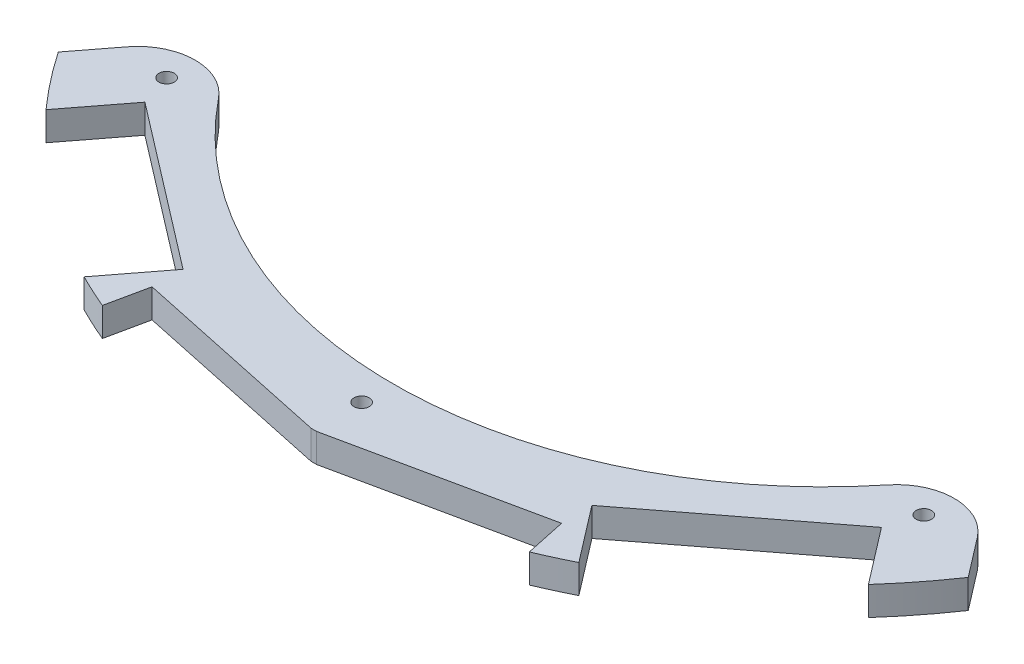
ISO-10303-21;
HEADER;
FILE_DESCRIPTION(('STEP AP214'),'2;1');
FILE_NAME('part.step','',(''),(''),'','','');
FILE_SCHEMA(('AUTOMOTIVE_DESIGN { 1 0 10303 214 1 1 1 1 }'));
ENDSEC;
DATA;
#1=APPLICATION_CONTEXT('core data for automotive mechanical design processes');
#2=APPLICATION_PROTOCOL_DEFINITION('international standard','automotive_design',2000,#1);
#3=PRODUCT_CONTEXT('',#1,'mechanical');
#4=PRODUCT('Part','Part','',(#3));
#5=PRODUCT_RELATED_PRODUCT_CATEGORY('part','',(#4));
#6=PRODUCT_DEFINITION_FORMATION('','',#4);
#7=PRODUCT_DEFINITION_CONTEXT('part definition',#1,'design');
#8=PRODUCT_DEFINITION('design','',#6,#7);
#9=PRODUCT_DEFINITION_SHAPE('','',#8);
#10=(LENGTH_UNIT() NAMED_UNIT(*) SI_UNIT(.MILLI.,.METRE.));
#11=(NAMED_UNIT(*) PLANE_ANGLE_UNIT() SI_UNIT($,.RADIAN.));
#12=(NAMED_UNIT(*) SI_UNIT($,.STERADIAN.) SOLID_ANGLE_UNIT());
#13=UNCERTAINTY_MEASURE_WITH_UNIT(LENGTH_MEASURE(1.E-05),#10,'distance_accuracy_value','');
#14=(GEOMETRIC_REPRESENTATION_CONTEXT(3) GLOBAL_UNCERTAINTY_ASSIGNED_CONTEXT((#13)) GLOBAL_UNIT_ASSIGNED_CONTEXT((#10,
#11,#12)) REPRESENTATION_CONTEXT('',''));
#15=CARTESIAN_POINT('',(0.,0.,0.));
#16=DIRECTION('',(0.,0.,1.));
#17=DIRECTION('',(1.,0.,0.));
#18=AXIS2_PLACEMENT_3D('',#15,#16,#17);
#19=CARTESIAN_POINT('',(84.021948487146,6.35,-34.47476750129));
#20=DIRECTION('',(0.,1.,0.));
#21=DIRECTION('',(0.,0.,1.));
#22=AXIS2_PLACEMENT_3D('',#19,#20,#21);
#23=PLANE('',#22);
#24=CARTESIAN_POINT('',(-83.8199999999999,6.35,-40.6400000000001));
#25=DIRECTION('',(0.,1.,0.));
#26=DIRECTION('',(0.,0.,-1.));
#27=AXIS2_PLACEMENT_3D('',#24,#25,#26);
#28=CIRCLE('',#27,1.70053000000001);
#29=CARTESIAN_POINT('',(-83.8199999999999,6.35,-42.3405300000001));
#30=VERTEX_POINT('',#29);
#31=EDGE_CURVE('E392',#30,#30,#28,.T.);
#32=ORIENTED_EDGE('',*,*,#31,.F.);
#33=EDGE_LOOP('',(#32));
#34=FACE_BOUND('',#33,.T.);
#35=CARTESIAN_POINT('',(84.021948487146,6.35,-34.47476750129));
#36=DIRECTION('',(0.,1.,0.));
#37=DIRECTION('',(0.,0.,1.));
#38=AXIS2_PLACEMENT_3D('',#35,#36,#37);
#39=CIRCLE('',#38,12.7);
#40=CARTESIAN_POINT('',(94.0975359088447,6.35,-42.2060376497007));
#41=VERTEX_POINT('',#40);
#42=CARTESIAN_POINT('',(74.1370133710112,6.35,-42.4483525011382));
#43=VERTEX_POINT('',#42);
#44=EDGE_CURVE('E243',#41,#43,#39,.T.);
#45=ORIENTED_EDGE('',*,*,#44,.T.);
#46=CARTESIAN_POINT('',(0.,6.35,-102.25024));
#47=DIRECTION('',(0.,-1.,0.));
#48=DIRECTION('',(0.,0.,-1.));
#49=AXIS2_PLACEMENT_3D('',#46,#47,#48);
#50=CIRCLE('',#49,95.25);
#51=CARTESIAN_POINT('',(-74.1370133710112,6.35,-42.4483525011383));
#52=VERTEX_POINT('',#51);
#53=EDGE_CURVE('E129',#43,#52,#50,.T.);
#54=ORIENTED_EDGE('',*,*,#53,.T.);
#55=CARTESIAN_POINT('',(-84.021948487146,6.35,-34.4747675012901));
#56=DIRECTION('',(0.,1.,0.));
#57=DIRECTION('',(0.,0.,-1.));
#58=AXIS2_PLACEMENT_3D('',#55,#56,#57);
#59=CIRCLE('',#58,12.7);
#60=CARTESIAN_POINT('',(-94.0975359088447,6.35,-42.2060376497008));
#61=VERTEX_POINT('',#60);
#62=EDGE_CURVE('E294',#52,#61,#59,.T.);
#63=ORIENTED_EDGE('',*,*,#62,.T.);
#64=DIRECTION('',(-0.608761429008708,0.,0.793353340291245));
#65=VECTOR('',#64,1.);
#66=CARTESIAN_POINT('',(-100.72984212007,6.35,-33.5626479147791));
#67=LINE('',#66,#65);
#68=CARTESIAN_POINT('',(-100.72984212007,6.35,-33.562647914779));
#69=VERTEX_POINT('',#68);
#70=EDGE_CURVE('E313',#61,#69,#67,.T.);
#71=ORIENTED_EDGE('',*,*,#70,.T.);
#72=CARTESIAN_POINT('',(0.,6.35,-102.25024));
#73=DIRECTION('',(0.,1.,0.));
#74=DIRECTION('',(0.,0.,-1.));
#75=AXIS2_PLACEMENT_3D('',#72,#73,#74);
#76=CIRCLE('',#75,121.92);
#77=CARTESIAN_POINT('',(-91.0399261764068,6.35,-21.1563546460821));
#78=VERTEX_POINT('',#77);
#79=EDGE_CURVE('E310',#69,#78,#76,.T.);
#80=ORIENTED_EDGE('',*,*,#79,.T.);
#81=DIRECTION('',(0.608761429008712,0.,-0.793353340291242));
#82=VECTOR('',#81,1.);
#83=CARTESIAN_POINT('',(-91.0399261764068,6.35,-21.1563546460821));
#84=LINE('',#83,#82);
#85=CARTESIAN_POINT('',(-81.5324725760255,6.35,-33.5467094092098));
#86=VERTEX_POINT('',#85);
#87=EDGE_CURVE('E312',#78,#86,#84,.T.);
#88=ORIENTED_EDGE('',*,*,#87,.T.);
#89=DIRECTION('',(0.793353340291238,0.,0.608761429008717));
#90=VECTOR('',#89,1.);
#91=CARTESIAN_POINT('',(-81.5324725760255,6.35,-33.5467094092098));
#92=LINE('',#91,#90);
#93=CARTESIAN_POINT('',(-45.26035785791,6.35,-5.71413687493115));
#94=VERTEX_POINT('',#93);
#95=EDGE_CURVE('E315',#86,#94,#92,.T.);
#96=ORIENTED_EDGE('',*,*,#95,.T.);
#97=DIRECTION('',(-0.608761429008719,0.,0.793353340291237));
#98=VECTOR('',#97,1.);
#99=CARTESIAN_POINT('',(-54.7678114582914,6.35,6.67621788819646));
#100=LINE('',#99,#98);
#101=CARTESIAN_POINT('',(-54.7678114582914,6.35,6.67621788819642));
#102=VERTEX_POINT('',#101);
#103=EDGE_CURVE('E321',#94,#102,#100,.T.);
#104=ORIENTED_EDGE('',*,*,#103,.T.);
#105=CARTESIAN_POINT('',(0.,6.35,-102.25024));
#106=DIRECTION('',(0.,1.,0.));
#107=DIRECTION('',(0.,0.,1.));
#108=AXIS2_PLACEMENT_3D('',#105,#106,#107);
#109=CIRCLE('',#108,121.92);
#110=CARTESIAN_POINT('',(-47.2594801269617,6.35,10.1376060427518));
#111=VERTEX_POINT('',#110);
#112=EDGE_CURVE('E323',#102,#111,#109,.T.);
#113=ORIENTED_EDGE('',*,*,#112,.T.);
#114=DIRECTION('',(0.207911690817761,0.,-0.978147600733805));
#115=VECTOR('',#114,1.);
#116=CARTESIAN_POINT('',(-47.2594801269617,6.35,10.1376060427518));
#117=LINE('',#116,#115);
#118=CARTESIAN_POINT('',(-45.332616871229,6.35,1.07242715298415));
#119=VERTEX_POINT('',#118);
#120=EDGE_CURVE('E325',#111,#119,#117,.T.);
#121=ORIENTED_EDGE('',*,*,#120,.T.);
#122=DIRECTION('',(0.978147600733805,0.,0.207911690817761));
#123=VECTOR('',#122,1.);
#124=CARTESIAN_POINT('',(-45.332616871229,6.35,1.07242715298415));
#125=LINE('',#124,#123);
#126=CARTESIAN_POINT('',(-0.611708565679415,6.35,10.5781496571722));
#127=VERTEX_POINT('',#126);
#128=EDGE_CURVE('E327',#119,#127,#125,.T.);
#129=ORIENTED_EDGE('',*,*,#128,.T.);
#130=DIRECTION('',(1.,0.,0.));
#131=VECTOR('',#130,1.);
#132=CARTESIAN_POINT('',(-0.611708565679415,6.35,10.5781496571722));
#133=LINE('',#132,#131);
#134=CARTESIAN_POINT('',(0.611708565679403,6.35,10.5781496571722));
#135=VERTEX_POINT('',#134);
#136=EDGE_CURVE('E329',#127,#135,#133,.T.);
#137=ORIENTED_EDGE('',*,*,#136,.T.);
#138=DIRECTION('',(0.978147600733805,0.,-0.20791169081776));
#139=VECTOR('',#138,1.);
#140=CARTESIAN_POINT('',(45.332616871229,6.35,1.0724271529842));
#141=LINE('',#140,#139);
#142=CARTESIAN_POINT('',(45.332616871229,6.35,1.0724271529842));
#143=VERTEX_POINT('',#142);
#144=EDGE_CURVE('E331',#135,#143,#141,.T.);
#145=ORIENTED_EDGE('',*,*,#144,.T.);
#146=DIRECTION('',(0.207911690817759,0.,0.978147600733806));
#147=VECTOR('',#146,1.);
#148=CARTESIAN_POINT('',(47.2594801269617,6.35,10.1376060427519));
#149=LINE('',#148,#147);
#150=CARTESIAN_POINT('',(47.2594801269617,6.35,10.1376060427519));
#151=VERTEX_POINT('',#150);
#152=EDGE_CURVE('E333',#143,#151,#149,.T.);
#153=ORIENTED_EDGE('',*,*,#152,.T.);
#154=CARTESIAN_POINT('',(0.,6.35,-102.25024));
#155=DIRECTION('',(0.,1.,0.));
#156=DIRECTION('',(0.,0.,-1.));
#157=AXIS2_PLACEMENT_3D('',#154,#155,#156);
#158=CIRCLE('',#157,121.92);
#159=CARTESIAN_POINT('',(54.7678114582914,6.35,6.67621788819651));
#160=VERTEX_POINT('',#159);
#161=EDGE_CURVE('E335',#151,#160,#158,.T.);
#162=ORIENTED_EDGE('',*,*,#161,.T.);
#163=DIRECTION('',(-0.608761429008718,0.,-0.793353340291237));
#164=VECTOR('',#163,1.);
#165=CARTESIAN_POINT('',(54.7678114582914,6.35,6.67621788819651));
#166=LINE('',#165,#164);
#167=CARTESIAN_POINT('',(45.26035785791,6.35,-5.71413687493111));
#168=VERTEX_POINT('',#167);
#169=EDGE_CURVE('E337',#160,#168,#166,.T.);
#170=ORIENTED_EDGE('',*,*,#169,.T.);
#171=DIRECTION('',(0.793353340291238,0.,-0.608761429008716));
#172=VECTOR('',#171,1.);
#173=CARTESIAN_POINT('',(45.26035785791,6.35,-5.71413687493111));
#174=LINE('',#173,#172);
#175=CARTESIAN_POINT('',(81.5324725760255,6.35,-33.5467094092097));
#176=VERTEX_POINT('',#175);
#177=EDGE_CURVE('E184',#168,#176,#174,.T.);
#178=ORIENTED_EDGE('',*,*,#177,.T.);
#179=DIRECTION('',(0.608761429008711,0.,0.793353340291242));
#180=VECTOR('',#179,1.);
#181=CARTESIAN_POINT('',(91.0399261764068,6.35,-21.156354646082));
#182=LINE('',#181,#180);
#183=CARTESIAN_POINT('',(91.0399261764068,6.35,-21.156354646082));
#184=VERTEX_POINT('',#183);
#185=EDGE_CURVE('E178',#176,#184,#182,.T.);
#186=ORIENTED_EDGE('',*,*,#185,.T.);
#187=CARTESIAN_POINT('',(0.,6.35,-102.25024));
#188=DIRECTION('',(0.,1.,0.));
#189=DIRECTION('',(0.,0.,1.));
#190=AXIS2_PLACEMENT_3D('',#187,#188,#189);
#191=CIRCLE('',#190,121.92);
#192=CARTESIAN_POINT('',(100.72984212007,6.35,-33.5626479147789));
#193=VERTEX_POINT('',#192);
#194=EDGE_CURVE('E182',#184,#193,#191,.T.);
#195=ORIENTED_EDGE('',*,*,#194,.T.);
#196=DIRECTION('',(-0.608761429008712,0.,-0.793353340291242));
#197=VECTOR('',#196,1.);
#198=CARTESIAN_POINT('',(100.72984212007,6.35,-33.5626479147789));
#199=LINE('',#198,#197);
#200=EDGE_CURVE('E50',#193,#41,#199,.T.);
#201=ORIENTED_EDGE('',*,*,#200,.T.);
#202=EDGE_LOOP('',(#45,#54,#63,#71,#80,#88,#96,#104,#113,#121,#129,#137,#145,#153,#162,#170,
#178,#186,#195,#201));
#203=FACE_BOUND('',#202,.T.);
#204=CARTESIAN_POINT('',(83.82,6.35,-40.64));
#205=DIRECTION('',(0.,1.,0.));
#206=DIRECTION('',(0.,0.,1.));
#207=AXIS2_PLACEMENT_3D('',#204,#205,#206);
#208=CIRCLE('',#207,1.70053000000001);
#209=CARTESIAN_POINT('',(83.82,6.35,-38.93947));
#210=VERTEX_POINT('',#209);
#211=EDGE_CURVE('E206',#210,#210,#208,.T.);
#212=ORIENTED_EDGE('',*,*,#211,.F.);
#213=EDGE_LOOP('',(#212));
#214=FACE_BOUND('',#213,.T.);
#215=CARTESIAN_POINT('',(0.,6.35,0.));
#216=DIRECTION('',(0.,1.,0.));
#217=DIRECTION('',(0.,0.,1.));
#218=AXIS2_PLACEMENT_3D('',#215,#216,#217);
#219=CIRCLE('',#218,1.70053);
#220=CARTESIAN_POINT('',(0.,6.35,1.70052999999993));
#221=VERTEX_POINT('',#220);
#222=EDGE_CURVE('E383',#221,#221,#219,.T.);
#223=ORIENTED_EDGE('',*,*,#222,.F.);
#224=EDGE_LOOP('',(#223));
#225=FACE_BOUND('',#224,.T.);
#226=ADVANCED_FACE('F33',(#34,#203,#214,#225),#23,.T.);
#227=CARTESIAN_POINT('',(84.021948487146,0.,-34.47476750129));
#228=DIRECTION('',(0.,1.,0.));
#229=DIRECTION('',(0.,0.,1.));
#230=AXIS2_PLACEMENT_3D('',#227,#228,#229);
#231=PLANE('',#230);
#232=CARTESIAN_POINT('',(-83.8199999999999,0.,-40.6400000000001));
#233=DIRECTION('',(0.,1.,0.));
#234=DIRECTION('',(0.,0.,-1.));
#235=AXIS2_PLACEMENT_3D('',#232,#233,#234);
#236=CIRCLE('',#235,1.70053000000001);
#237=CARTESIAN_POINT('',(-83.8199999999999,0.,-42.3405300000001));
#238=VERTEX_POINT('',#237);
#239=EDGE_CURVE('E389',#238,#238,#236,.T.);
#240=ORIENTED_EDGE('',*,*,#239,.T.);
#241=EDGE_LOOP('',(#240));
#242=FACE_BOUND('',#241,.T.);
#243=CARTESIAN_POINT('',(84.021948487146,0.,-34.47476750129));
#244=DIRECTION('',(0.,1.,0.));
#245=DIRECTION('',(0.,0.,1.));
#246=AXIS2_PLACEMENT_3D('',#243,#244,#245);
#247=CIRCLE('',#246,12.7);
#248=CARTESIAN_POINT('',(94.0975359088447,0.,-42.2060376497007));
#249=VERTEX_POINT('',#248);
#250=CARTESIAN_POINT('',(74.1370133710112,0.,-42.4483525011382));
#251=VERTEX_POINT('',#250);
#252=EDGE_CURVE('E202',#249,#251,#247,.T.);
#253=ORIENTED_EDGE('',*,*,#252,.F.);
#254=DIRECTION('',(-0.608761429008712,0.,-0.793353340291242));
#255=VECTOR('',#254,1.);
#256=CARTESIAN_POINT('',(100.72984212007,0.,-33.5626479147789));
#257=LINE('',#256,#255);
#258=CARTESIAN_POINT('',(100.72984212007,0.,-33.5626479147789));
#259=VERTEX_POINT('',#258);
#260=EDGE_CURVE('E121',#259,#249,#257,.T.);
#261=ORIENTED_EDGE('',*,*,#260,.F.);
#262=CARTESIAN_POINT('',(0.,0.,-102.25024));
#263=DIRECTION('',(0.,1.,0.));
#264=DIRECTION('',(0.,0.,1.));
#265=AXIS2_PLACEMENT_3D('',#262,#263,#264);
#266=CIRCLE('',#265,121.92);
#267=CARTESIAN_POINT('',(91.0399261764068,0.,-21.156354646082));
#268=VERTEX_POINT('',#267);
#269=EDGE_CURVE('E115',#268,#259,#266,.T.);
#270=ORIENTED_EDGE('',*,*,#269,.F.);
#271=DIRECTION('',(0.608761429008711,0.,0.793353340291242));
#272=VECTOR('',#271,1.);
#273=CARTESIAN_POINT('',(91.0399261764068,0.,-21.156354646082));
#274=LINE('',#273,#272);
#275=CARTESIAN_POINT('',(81.5324725760255,0.,-33.5467094092097));
#276=VERTEX_POINT('',#275);
#277=EDGE_CURVE('E192',#276,#268,#274,.T.);
#278=ORIENTED_EDGE('',*,*,#277,.F.);
#279=DIRECTION('',(0.793353340291238,0.,-0.608761429008716));
#280=VECTOR('',#279,1.);
#281=CARTESIAN_POINT('',(81.5324725760255,0.,-33.5467094092097));
#282=LINE('',#281,#280);
#283=CARTESIAN_POINT('',(45.26035785791,0.,-5.71413687493111));
#284=VERTEX_POINT('',#283);
#285=EDGE_CURVE('E238',#284,#276,#282,.T.);
#286=ORIENTED_EDGE('',*,*,#285,.F.);
#287=DIRECTION('',(-0.608761429008718,0.,-0.793353340291237));
#288=VECTOR('',#287,1.);
#289=CARTESIAN_POINT('',(54.7678114582914,0.,6.67621788819651));
#290=LINE('',#289,#288);
#291=CARTESIAN_POINT('',(54.7678114582914,0.,6.67621788819651));
#292=VERTEX_POINT('',#291);
#293=EDGE_CURVE('E235',#292,#284,#290,.T.);
#294=ORIENTED_EDGE('',*,*,#293,.F.);
#295=CARTESIAN_POINT('',(0.,0.,-102.25024));
#296=DIRECTION('',(0.,1.,0.));
#297=DIRECTION('',(0.,0.,-1.));
#298=AXIS2_PLACEMENT_3D('',#295,#296,#297);
#299=CIRCLE('',#298,121.92);
#300=CARTESIAN_POINT('',(47.2594801269617,0.,10.1376060427519));
#301=VERTEX_POINT('',#300);
#302=EDGE_CURVE('E233',#301,#292,#299,.T.);
#303=ORIENTED_EDGE('',*,*,#302,.F.);
#304=DIRECTION('',(0.207911690817759,0.,0.978147600733806));
#305=VECTOR('',#304,1.);
#306=CARTESIAN_POINT('',(47.2594801269617,0.,10.1376060427519));
#307=LINE('',#306,#305);
#308=CARTESIAN_POINT('',(45.332616871229,0.,1.0724271529842));
#309=VERTEX_POINT('',#308);
#310=EDGE_CURVE('E231',#309,#301,#307,.T.);
#311=ORIENTED_EDGE('',*,*,#310,.F.);
#312=DIRECTION('',(0.978147600733805,0.,-0.20791169081776));
#313=VECTOR('',#312,1.);
#314=CARTESIAN_POINT('',(45.332616871229,0.,1.0724271529842));
#315=LINE('',#314,#313);
#316=CARTESIAN_POINT('',(0.611708565679403,0.,10.5781496571722));
#317=VERTEX_POINT('',#316);
#318=EDGE_CURVE('E229',#317,#309,#315,.T.);
#319=ORIENTED_EDGE('',*,*,#318,.F.);
#320=DIRECTION('',(1.,0.,0.));
#321=VECTOR('',#320,1.);
#322=CARTESIAN_POINT('',(-0.611708565679415,0.,10.5781496571722));
#323=LINE('',#322,#321);
#324=CARTESIAN_POINT('',(-0.611708565679415,0.,10.5781496571722));
#325=VERTEX_POINT('',#324);
#326=EDGE_CURVE('E227',#325,#317,#323,.T.);
#327=ORIENTED_EDGE('',*,*,#326,.F.);
#328=DIRECTION('',(0.978147600733805,0.,0.207911690817761));
#329=VECTOR('',#328,1.);
#330=CARTESIAN_POINT('',(-45.332616871229,0.,1.07242715298415));
#331=LINE('',#330,#329);
#332=CARTESIAN_POINT('',(-45.332616871229,0.,1.07242715298415));
#333=VERTEX_POINT('',#332);
#334=EDGE_CURVE('E225',#333,#325,#331,.T.);
#335=ORIENTED_EDGE('',*,*,#334,.F.);
#336=DIRECTION('',(0.207911690817761,0.,-0.978147600733805));
#337=VECTOR('',#336,1.);
#338=CARTESIAN_POINT('',(-47.2594801269617,0.,10.1376060427518));
#339=LINE('',#338,#337);
#340=CARTESIAN_POINT('',(-47.2594801269617,0.,10.1376060427518));
#341=VERTEX_POINT('',#340);
#342=EDGE_CURVE('E223',#341,#333,#339,.T.);
#343=ORIENTED_EDGE('',*,*,#342,.F.);
#344=CARTESIAN_POINT('',(0.,0.,-102.25024));
#345=DIRECTION('',(0.,1.,0.));
#346=DIRECTION('',(0.,0.,1.));
#347=AXIS2_PLACEMENT_3D('',#344,#345,#346);
#348=CIRCLE('',#347,121.92);
#349=CARTESIAN_POINT('',(-54.7678114582914,0.,6.67621788819642));
#350=VERTEX_POINT('',#349);
#351=EDGE_CURVE('E221',#350,#341,#348,.T.);
#352=ORIENTED_EDGE('',*,*,#351,.F.);
#353=DIRECTION('',(-0.608761429008719,0.,0.793353340291237));
#354=VECTOR('',#353,1.);
#355=CARTESIAN_POINT('',(-54.7678114582914,0.,6.67621788819646));
#356=LINE('',#355,#354);
#357=CARTESIAN_POINT('',(-45.26035785791,0.,-5.71413687493115));
#358=VERTEX_POINT('',#357);
#359=EDGE_CURVE('E219',#358,#350,#356,.T.);
#360=ORIENTED_EDGE('',*,*,#359,.F.);
#361=DIRECTION('',(0.793353340291237,0.,0.608761429008718));
#362=VECTOR('',#361,1.);
#363=CARTESIAN_POINT('',(-45.26035785791,0.,-5.71413687493115));
#364=LINE('',#363,#362);
#365=CARTESIAN_POINT('',(-81.5324725760255,0.,-33.5467094092098));
#366=VERTEX_POINT('',#365);
#367=EDGE_CURVE('E217',#366,#358,#364,.T.);
#368=ORIENTED_EDGE('',*,*,#367,.F.);
#369=DIRECTION('',(0.608761429008712,0.,-0.793353340291242));
#370=VECTOR('',#369,1.);
#371=CARTESIAN_POINT('',(-91.0399261764068,0.,-21.1563546460821));
#372=LINE('',#371,#370);
#373=CARTESIAN_POINT('',(-91.0399261764068,0.,-21.1563546460821));
#374=VERTEX_POINT('',#373);
#375=EDGE_CURVE('E214',#374,#366,#372,.T.);
#376=ORIENTED_EDGE('',*,*,#375,.F.);
#377=CARTESIAN_POINT('',(0.,0.,-102.25024));
#378=DIRECTION('',(0.,1.,0.));
#379=DIRECTION('',(0.,0.,-1.));
#380=AXIS2_PLACEMENT_3D('',#377,#378,#379);
#381=CIRCLE('',#380,121.92);
#382=CARTESIAN_POINT('',(-100.72984212007,0.,-33.562647914779));
#383=VERTEX_POINT('',#382);
#384=EDGE_CURVE('E212',#383,#374,#381,.T.);
#385=ORIENTED_EDGE('',*,*,#384,.F.);
#386=DIRECTION('',(-0.608761429008708,0.,0.793353340291245));
#387=VECTOR('',#386,1.);
#388=CARTESIAN_POINT('',(-100.72984212007,0.,-33.5626479147791));
#389=LINE('',#388,#387);
#390=CARTESIAN_POINT('',(-94.0975359088447,0.,-42.2060376497008));
#391=VERTEX_POINT('',#390);
#392=EDGE_CURVE('E210',#391,#383,#389,.T.);
#393=ORIENTED_EDGE('',*,*,#392,.F.);
#394=CARTESIAN_POINT('',(-84.021948487146,0.,-34.4747675012901));
#395=DIRECTION('',(0.,1.,0.));
#396=DIRECTION('',(0.,0.,-1.));
#397=AXIS2_PLACEMENT_3D('',#394,#395,#396);
#398=CIRCLE('',#397,12.7);
#399=CARTESIAN_POINT('',(-74.1370133710112,0.,-42.4483525011383));
#400=VERTEX_POINT('',#399);
#401=EDGE_CURVE('E208',#400,#391,#398,.T.);
#402=ORIENTED_EDGE('',*,*,#401,.F.);
#403=CARTESIAN_POINT('',(0.,0.,-102.25024));
#404=DIRECTION('',(0.,-1.,0.));
#405=DIRECTION('',(0.,0.,-1.));
#406=AXIS2_PLACEMENT_3D('',#403,#404,#405);
#407=CIRCLE('',#406,95.25);
#408=EDGE_CURVE('E205',#251,#400,#407,.T.);
#409=ORIENTED_EDGE('',*,*,#408,.F.);
#410=EDGE_LOOP('',(#253,#261,#270,#278,#286,#294,#303,#311,#319,#327,#335,#343,#352,#360,#368,
#376,#385,#393,#402,#409));
#411=FACE_BOUND('',#410,.T.);
#412=CARTESIAN_POINT('',(83.82,0.,-40.64));
#413=DIRECTION('',(0.,1.,0.));
#414=DIRECTION('',(0.,0.,1.));
#415=AXIS2_PLACEMENT_3D('',#412,#413,#414);
#416=CIRCLE('',#415,1.70053000000001);
#417=CARTESIAN_POINT('',(83.82,0.,-38.93947));
#418=VERTEX_POINT('',#417);
#419=EDGE_CURVE('E395',#418,#418,#416,.T.);
#420=ORIENTED_EDGE('',*,*,#419,.T.);
#421=EDGE_LOOP('',(#420));
#422=FACE_BOUND('',#421,.T.);
#423=CARTESIAN_POINT('',(0.,0.,0.));
#424=DIRECTION('',(0.,1.,0.));
#425=DIRECTION('',(0.,0.,1.));
#426=AXIS2_PLACEMENT_3D('',#423,#424,#425);
#427=CIRCLE('',#426,1.70053);
#428=CARTESIAN_POINT('',(0.,0.,1.70052999999993));
#429=VERTEX_POINT('',#428);
#430=EDGE_CURVE('E386',#429,#429,#427,.T.);
#431=ORIENTED_EDGE('',*,*,#430,.T.);
#432=EDGE_LOOP('',(#431));
#433=FACE_BOUND('',#432,.T.);
#434=ADVANCED_FACE('F298',(#242,#411,#422,#433),#231,.F.);
#435=CARTESIAN_POINT('',(84.021948487146,6.35,-34.47476750129));
#436=DIRECTION('',(0.,-1.,0.));
#437=DIRECTION('',(0.,0.,-1.));
#438=AXIS2_PLACEMENT_3D('',#435,#436,#437);
#439=CYLINDRICAL_SURFACE('',#438,12.7);
#440=ORIENTED_EDGE('',*,*,#252,.T.);
#441=DIRECTION('',(0.,-1.,0.));
#442=VECTOR('',#441,1.);
#443=CARTESIAN_POINT('',(74.1370133710112,6.35,-42.4483525011382));
#444=LINE('',#443,#442);
#445=EDGE_CURVE('E11',#43,#251,#444,.T.);
#446=ORIENTED_EDGE('',*,*,#445,.F.);
#447=ORIENTED_EDGE('',*,*,#44,.F.);
#448=DIRECTION('',(0.,-1.,0.));
#449=VECTOR('',#448,1.);
#450=CARTESIAN_POINT('',(94.0975359088447,6.35,-42.2060376497007));
#451=LINE('',#450,#449);
#452=EDGE_CURVE('E198',#41,#249,#451,.T.);
#453=ORIENTED_EDGE('',*,*,#452,.T.);
#454=EDGE_LOOP('',(#440,#446,#447,#453));
#455=FACE_BOUND('',#454,.T.);
#456=ADVANCED_FACE('F35',(#455),#439,.T.);
#457=CARTESIAN_POINT('',(0.,6.35,-102.25024));
#458=DIRECTION('',(0.,-1.,0.));
#459=DIRECTION('',(0.,0.,-1.));
#460=AXIS2_PLACEMENT_3D('',#457,#458,#459);
#461=CYLINDRICAL_SURFACE('',#460,95.25);
#462=ORIENTED_EDGE('',*,*,#408,.T.);
#463=DIRECTION('',(0.,-1.,0.));
#464=VECTOR('',#463,1.);
#465=CARTESIAN_POINT('',(-74.1370133710112,6.35,-42.4483525011383));
#466=LINE('',#465,#464);
#467=EDGE_CURVE('E42',#52,#400,#466,.T.);
#468=ORIENTED_EDGE('',*,*,#467,.F.);
#469=ORIENTED_EDGE('',*,*,#53,.F.);
#470=ORIENTED_EDGE('',*,*,#445,.T.);
#471=EDGE_LOOP('',(#462,#468,#469,#470));
#472=FACE_BOUND('',#471,.T.);
#473=ADVANCED_FACE('F578',(#472),#461,.F.);
#474=CARTESIAN_POINT('',(-84.021948487146,6.35,-34.4747675012901));
#475=DIRECTION('',(0.,-1.,0.));
#476=DIRECTION('',(0.,0.,-1.));
#477=AXIS2_PLACEMENT_3D('',#474,#475,#476);
#478=CYLINDRICAL_SURFACE('',#477,12.7);
#479=ORIENTED_EDGE('',*,*,#401,.T.);
#480=DIRECTION('',(0.,-1.,0.));
#481=VECTOR('',#480,1.);
#482=CARTESIAN_POINT('',(-94.0975359088447,6.35,-42.2060376497008));
#483=LINE('',#482,#481);
#484=EDGE_CURVE('E286',#61,#391,#483,.T.);
#485=ORIENTED_EDGE('',*,*,#484,.F.);
#486=ORIENTED_EDGE('',*,*,#62,.F.);
#487=ORIENTED_EDGE('',*,*,#467,.T.);
#488=EDGE_LOOP('',(#479,#485,#486,#487));
#489=FACE_BOUND('',#488,.T.);
#490=ADVANCED_FACE('F292',(#489),#478,.T.);
#491=CARTESIAN_POINT('',(-100.72984212007,6.35,-33.5626479147791));
#492=DIRECTION('',(0.793353340291245,0.,0.608761429008708));
#493=DIRECTION('',(0.608761429008708,0.,-0.793353340291245));
#494=AXIS2_PLACEMENT_3D('',#491,#492,#493);
#495=PLANE('',#494);
#496=ORIENTED_EDGE('',*,*,#392,.T.);
#497=DIRECTION('',(0.,-1.,0.));
#498=VECTOR('',#497,1.);
#499=CARTESIAN_POINT('',(-100.72984212007,6.35,-33.562647914779));
#500=LINE('',#499,#498);
#501=EDGE_CURVE('E283',#69,#383,#500,.T.);
#502=ORIENTED_EDGE('',*,*,#501,.F.);
#503=ORIENTED_EDGE('',*,*,#70,.F.);
#504=ORIENTED_EDGE('',*,*,#484,.T.);
#505=EDGE_LOOP('',(#496,#502,#503,#504));
#506=FACE_BOUND('',#505,.T.);
#507=ADVANCED_FACE('F304',(#506),#495,.F.);
#508=CARTESIAN_POINT('',(0.,6.35,-102.25024));
#509=DIRECTION('',(0.,-1.,0.));
#510=DIRECTION('',(0.,0.,-1.));
#511=AXIS2_PLACEMENT_3D('',#508,#509,#510);
#512=CYLINDRICAL_SURFACE('',#511,121.92);
#513=ORIENTED_EDGE('',*,*,#384,.T.);
#514=DIRECTION('',(0.,-1.,0.));
#515=VECTOR('',#514,1.);
#516=CARTESIAN_POINT('',(-91.0399261764068,6.35,-21.1563546460821));
#517=LINE('',#516,#515);
#518=EDGE_CURVE('E280',#78,#374,#517,.T.);
#519=ORIENTED_EDGE('',*,*,#518,.F.);
#520=ORIENTED_EDGE('',*,*,#79,.F.);
#521=ORIENTED_EDGE('',*,*,#501,.T.);
#522=EDGE_LOOP('',(#513,#519,#520,#521));
#523=FACE_BOUND('',#522,.T.);
#524=ADVANCED_FACE('F308',(#523),#512,.T.);
#525=CARTESIAN_POINT('',(-91.0399261764068,6.35,-21.1563546460821));
#526=DIRECTION('',(-0.793353340291242,0.,-0.608761429008712));
#527=DIRECTION('',(-0.608761429008712,0.,0.793353340291242));
#528=AXIS2_PLACEMENT_3D('',#525,#526,#527);
#529=PLANE('',#528);
#530=ORIENTED_EDGE('',*,*,#375,.T.);
#531=DIRECTION('',(0.,-1.,0.));
#532=VECTOR('',#531,1.);
#533=CARTESIAN_POINT('',(-81.5324725760255,6.35,-33.5467094092098));
#534=LINE('',#533,#532);
#535=EDGE_CURVE('E277',#86,#366,#534,.T.);
#536=ORIENTED_EDGE('',*,*,#535,.F.);
#537=ORIENTED_EDGE('',*,*,#87,.F.);
#538=ORIENTED_EDGE('',*,*,#518,.T.);
#539=EDGE_LOOP('',(#530,#536,#537,#538));
#540=FACE_BOUND('',#539,.T.);
#541=ADVANCED_FACE('F542',(#540),#529,.F.);
#542=CARTESIAN_POINT('',(-45.26035785791,6.35,-5.71413687493115));
#543=DIRECTION('',(0.608761429008718,0.,-0.793353340291237));
#544=DIRECTION('',(-0.793353340291237,0.,-0.608761429008718));
#545=AXIS2_PLACEMENT_3D('',#542,#543,#544);
#546=PLANE('',#545);
#547=ORIENTED_EDGE('',*,*,#367,.T.);
#548=DIRECTION('',(0.,-1.,0.));
#549=VECTOR('',#548,1.);
#550=CARTESIAN_POINT('',(-45.26035785791,6.35,-5.71413687493115));
#551=LINE('',#550,#549);
#552=EDGE_CURVE('E274',#94,#358,#551,.T.);
#553=ORIENTED_EDGE('',*,*,#552,.F.);
#554=ORIENTED_EDGE('',*,*,#95,.F.);
#555=ORIENTED_EDGE('',*,*,#535,.T.);
#556=EDGE_LOOP('',(#547,#553,#554,#555));
#557=FACE_BOUND('',#556,.T.);
#558=ADVANCED_FACE('F532',(#557),#546,.F.);
#559=CARTESIAN_POINT('',(-54.7678114582914,6.35,6.67621788819646));
#560=DIRECTION('',(0.793353340291237,0.,0.608761429008719));
#561=DIRECTION('',(0.608761429008719,0.,-0.793353340291237));
#562=AXIS2_PLACEMENT_3D('',#559,#560,#561);
#563=PLANE('',#562);
#564=ORIENTED_EDGE('',*,*,#359,.T.);
#565=DIRECTION('',(0.,-1.,0.));
#566=VECTOR('',#565,1.);
#567=CARTESIAN_POINT('',(-54.7678114582914,6.35,6.67621788819642));
#568=LINE('',#567,#566);
#569=EDGE_CURVE('E271',#102,#350,#568,.T.);
#570=ORIENTED_EDGE('',*,*,#569,.F.);
#571=ORIENTED_EDGE('',*,*,#103,.F.);
#572=ORIENTED_EDGE('',*,*,#552,.T.);
#573=EDGE_LOOP('',(#564,#570,#571,#572));
#574=FACE_BOUND('',#573,.T.);
#575=ADVANCED_FACE('F522',(#574),#563,.F.);
#576=CARTESIAN_POINT('',(0.,6.35,-102.25024));
#577=DIRECTION('',(0.,-1.,0.));
#578=DIRECTION('',(0.,0.,-1.));
#579=AXIS2_PLACEMENT_3D('',#576,#577,#578);
#580=CYLINDRICAL_SURFACE('',#579,121.92);
#581=ORIENTED_EDGE('',*,*,#351,.T.);
#582=DIRECTION('',(0.,-1.,0.));
#583=VECTOR('',#582,1.);
#584=CARTESIAN_POINT('',(-47.2594801269617,6.35,10.1376060427518));
#585=LINE('',#584,#583);
#586=EDGE_CURVE('E268',#111,#341,#585,.T.);
#587=ORIENTED_EDGE('',*,*,#586,.F.);
#588=ORIENTED_EDGE('',*,*,#112,.F.);
#589=ORIENTED_EDGE('',*,*,#569,.T.);
#590=EDGE_LOOP('',(#581,#587,#588,#589));
#591=FACE_BOUND('',#590,.T.);
#592=ADVANCED_FACE('F512',(#591),#580,.T.);
#593=CARTESIAN_POINT('',(-47.2594801269617,6.35,10.1376060427518));
#594=DIRECTION('',(-0.978147600733805,0.,-0.207911690817761));
#595=DIRECTION('',(-0.207911690817761,0.,0.978147600733805));
#596=AXIS2_PLACEMENT_3D('',#593,#594,#595);
#597=PLANE('',#596);
#598=ORIENTED_EDGE('',*,*,#342,.T.);
#599=DIRECTION('',(0.,-1.,0.));
#600=VECTOR('',#599,1.);
#601=CARTESIAN_POINT('',(-45.332616871229,6.35,1.07242715298415));
#602=LINE('',#601,#600);
#603=EDGE_CURVE('E265',#119,#333,#602,.T.);
#604=ORIENTED_EDGE('',*,*,#603,.F.);
#605=ORIENTED_EDGE('',*,*,#120,.F.);
#606=ORIENTED_EDGE('',*,*,#586,.T.);
#607=EDGE_LOOP('',(#598,#604,#605,#606));
#608=FACE_BOUND('',#607,.T.);
#609=ADVANCED_FACE('F502',(#608),#597,.F.);
#610=CARTESIAN_POINT('',(-45.332616871229,6.35,1.07242715298415));
#611=DIRECTION('',(0.207911690817761,0.,-0.978147600733805));
#612=DIRECTION('',(-0.978147600733805,0.,-0.207911690817761));
#613=AXIS2_PLACEMENT_3D('',#610,#611,#612);
#614=PLANE('',#613);
#615=ORIENTED_EDGE('',*,*,#334,.T.);
#616=DIRECTION('',(0.,-1.,0.));
#617=VECTOR('',#616,1.);
#618=CARTESIAN_POINT('',(-0.611708565679415,6.35,10.5781496571722));
#619=LINE('',#618,#617);
#620=EDGE_CURVE('E262',#127,#325,#619,.T.);
#621=ORIENTED_EDGE('',*,*,#620,.F.);
#622=ORIENTED_EDGE('',*,*,#128,.F.);
#623=ORIENTED_EDGE('',*,*,#603,.T.);
#624=EDGE_LOOP('',(#615,#621,#622,#623));
#625=FACE_BOUND('',#624,.T.);
#626=ADVANCED_FACE('F492',(#625),#614,.F.);
#627=CARTESIAN_POINT('',(-0.611708565679415,6.35,10.5781496571722));
#628=DIRECTION('',(0.,0.,-1.));
#629=DIRECTION('',(-1.,0.,0.));
#630=AXIS2_PLACEMENT_3D('',#627,#628,#629);
#631=PLANE('',#630);
#632=ORIENTED_EDGE('',*,*,#326,.T.);
#633=DIRECTION('',(0.,-1.,0.));
#634=VECTOR('',#633,1.);
#635=CARTESIAN_POINT('',(0.611708565679403,6.35,10.5781496571722));
#636=LINE('',#635,#634);
#637=EDGE_CURVE('E259',#135,#317,#636,.T.);
#638=ORIENTED_EDGE('',*,*,#637,.F.);
#639=ORIENTED_EDGE('',*,*,#136,.F.);
#640=ORIENTED_EDGE('',*,*,#620,.T.);
#641=EDGE_LOOP('',(#632,#638,#639,#640));
#642=FACE_BOUND('',#641,.T.);
#643=ADVANCED_FACE('F482',(#642),#631,.F.);
#644=CARTESIAN_POINT('',(45.332616871229,6.35,1.0724271529842));
#645=DIRECTION('',(-0.20791169081776,0.,-0.978147600733805));
#646=DIRECTION('',(-0.978147600733805,0.,0.20791169081776));
#647=AXIS2_PLACEMENT_3D('',#644,#645,#646);
#648=PLANE('',#647);
#649=ORIENTED_EDGE('',*,*,#318,.T.);
#650=DIRECTION('',(0.,-1.,0.));
#651=VECTOR('',#650,1.);
#652=CARTESIAN_POINT('',(45.332616871229,6.35,1.0724271529842));
#653=LINE('',#652,#651);
#654=EDGE_CURVE('E256',#143,#309,#653,.T.);
#655=ORIENTED_EDGE('',*,*,#654,.F.);
#656=ORIENTED_EDGE('',*,*,#144,.F.);
#657=ORIENTED_EDGE('',*,*,#637,.T.);
#658=EDGE_LOOP('',(#649,#655,#656,#657));
#659=FACE_BOUND('',#658,.T.);
#660=ADVANCED_FACE('F472',(#659),#648,.F.);
#661=CARTESIAN_POINT('',(47.2594801269617,6.35,10.1376060427519));
#662=DIRECTION('',(0.978147600733806,0.,-0.207911690817759));
#663=DIRECTION('',(-0.207911690817759,0.,-0.978147600733806));
#664=AXIS2_PLACEMENT_3D('',#661,#662,#663);
#665=PLANE('',#664);
#666=ORIENTED_EDGE('',*,*,#310,.T.);
#667=DIRECTION('',(0.,-1.,0.));
#668=VECTOR('',#667,1.);
#669=CARTESIAN_POINT('',(47.2594801269617,6.35,10.1376060427519));
#670=LINE('',#669,#668);
#671=EDGE_CURVE('E253',#151,#301,#670,.T.);
#672=ORIENTED_EDGE('',*,*,#671,.F.);
#673=ORIENTED_EDGE('',*,*,#152,.F.);
#674=ORIENTED_EDGE('',*,*,#654,.T.);
#675=EDGE_LOOP('',(#666,#672,#673,#674));
#676=FACE_BOUND('',#675,.T.);
#677=ADVANCED_FACE('F462',(#676),#665,.F.);
#678=CARTESIAN_POINT('',(0.,6.35,-102.25024));
#679=DIRECTION('',(0.,-1.,0.));
#680=DIRECTION('',(0.,0.,-1.));
#681=AXIS2_PLACEMENT_3D('',#678,#679,#680);
#682=CYLINDRICAL_SURFACE('',#681,121.92);
#683=ORIENTED_EDGE('',*,*,#302,.T.);
#684=DIRECTION('',(0.,-1.,0.));
#685=VECTOR('',#684,1.);
#686=CARTESIAN_POINT('',(54.7678114582914,6.35,6.67621788819651));
#687=LINE('',#686,#685);
#688=EDGE_CURVE('E250',#160,#292,#687,.T.);
#689=ORIENTED_EDGE('',*,*,#688,.F.);
#690=ORIENTED_EDGE('',*,*,#161,.F.);
#691=ORIENTED_EDGE('',*,*,#671,.T.);
#692=EDGE_LOOP('',(#683,#689,#690,#691));
#693=FACE_BOUND('',#692,.T.);
#694=ADVANCED_FACE('F453',(#693),#682,.T.);
#695=CARTESIAN_POINT('',(54.7678114582914,6.35,6.67621788819651));
#696=DIRECTION('',(-0.793353340291237,0.,0.608761429008718));
#697=DIRECTION('',(0.608761429008718,0.,0.793353340291237));
#698=AXIS2_PLACEMENT_3D('',#695,#696,#697);
#699=PLANE('',#698);
#700=ORIENTED_EDGE('',*,*,#293,.T.);
#701=DIRECTION('',(0.,-1.,0.));
#702=VECTOR('',#701,1.);
#703=CARTESIAN_POINT('',(45.26035785791,6.35,-5.71413687493111));
#704=LINE('',#703,#702);
#705=EDGE_CURVE('E247',#168,#284,#704,.T.);
#706=ORIENTED_EDGE('',*,*,#705,.F.);
#707=ORIENTED_EDGE('',*,*,#169,.F.);
#708=ORIENTED_EDGE('',*,*,#688,.T.);
#709=EDGE_LOOP('',(#700,#706,#707,#708));
#710=FACE_BOUND('',#709,.T.);
#711=ADVANCED_FACE('F343',(#710),#699,.F.);
#712=CARTESIAN_POINT('',(81.5324725760255,6.35,-33.5467094092097));
#713=DIRECTION('',(-0.608761429008717,0.,-0.793353340291238));
#714=DIRECTION('',(-0.793353340291238,0.,0.608761429008717));
#715=AXIS2_PLACEMENT_3D('',#712,#713,#714);
#716=PLANE('',#715);
#717=ORIENTED_EDGE('',*,*,#285,.T.);
#718=DIRECTION('',(0.,-1.,0.));
#719=VECTOR('',#718,1.);
#720=CARTESIAN_POINT('',(81.5324725760255,6.35,-33.5467094092097));
#721=LINE('',#720,#719);
#722=EDGE_CURVE('E193',#176,#276,#721,.T.);
#723=ORIENTED_EDGE('',*,*,#722,.F.);
#724=ORIENTED_EDGE('',*,*,#177,.F.);
#725=ORIENTED_EDGE('',*,*,#705,.T.);
#726=EDGE_LOOP('',(#717,#723,#724,#725));
#727=FACE_BOUND('',#726,.T.);
#728=ADVANCED_FACE('F346',(#727),#716,.F.);
#729=CARTESIAN_POINT('',(91.0399261764068,6.35,-21.156354646082));
#730=DIRECTION('',(0.793353340291242,0.,-0.608761429008711));
#731=DIRECTION('',(-0.608761429008711,0.,-0.793353340291242));
#732=AXIS2_PLACEMENT_3D('',#729,#730,#731);
#733=PLANE('',#732);
#734=ORIENTED_EDGE('',*,*,#277,.T.);
#735=DIRECTION('',(0.,-1.,0.));
#736=VECTOR('',#735,1.);
#737=CARTESIAN_POINT('',(91.0399261764068,6.35,-21.156354646082));
#738=LINE('',#737,#736);
#739=EDGE_CURVE('E189',#184,#268,#738,.T.);
#740=ORIENTED_EDGE('',*,*,#739,.F.);
#741=ORIENTED_EDGE('',*,*,#185,.F.);
#742=ORIENTED_EDGE('',*,*,#722,.T.);
#743=EDGE_LOOP('',(#734,#740,#741,#742));
#744=FACE_BOUND('',#743,.T.);
#745=ADVANCED_FACE('F190',(#744),#733,.F.);
#746=CARTESIAN_POINT('',(0.,6.35,-102.25024));
#747=DIRECTION('',(0.,-1.,0.));
#748=DIRECTION('',(0.,0.,-1.));
#749=AXIS2_PLACEMENT_3D('',#746,#747,#748);
#750=CYLINDRICAL_SURFACE('',#749,121.92);
#751=ORIENTED_EDGE('',*,*,#269,.T.);
#752=DIRECTION('',(0.,-1.,0.));
#753=VECTOR('',#752,1.);
#754=CARTESIAN_POINT('',(100.72984212007,6.35,-33.5626479147789));
#755=LINE('',#754,#753);
#756=EDGE_CURVE('E194',#193,#259,#755,.T.);
#757=ORIENTED_EDGE('',*,*,#756,.F.);
#758=ORIENTED_EDGE('',*,*,#194,.F.);
#759=ORIENTED_EDGE('',*,*,#739,.T.);
#760=EDGE_LOOP('',(#751,#757,#758,#759));
#761=FACE_BOUND('',#760,.T.);
#762=ADVANCED_FACE('F196',(#761),#750,.T.);
#763=CARTESIAN_POINT('',(100.72984212007,6.35,-33.5626479147789));
#764=DIRECTION('',(-0.793353340291242,0.,0.608761429008712));
#765=DIRECTION('',(0.608761429008712,0.,0.793353340291242));
#766=AXIS2_PLACEMENT_3D('',#763,#764,#765);
#767=PLANE('',#766);
#768=ORIENTED_EDGE('',*,*,#260,.T.);
#769=ORIENTED_EDGE('',*,*,#452,.F.);
#770=ORIENTED_EDGE('',*,*,#200,.F.);
#771=ORIENTED_EDGE('',*,*,#756,.T.);
#772=EDGE_LOOP('',(#768,#769,#770,#771));
#773=FACE_BOUND('',#772,.T.);
#774=ADVANCED_FACE('F350',(#773),#767,.F.);
#775=CARTESIAN_POINT('',(83.82,6.35,-40.64));
#776=DIRECTION('',(0.,-1.,0.));
#777=DIRECTION('',(0.,0.,-1.));
#778=AXIS2_PLACEMENT_3D('',#775,#776,#777);
#779=CYLINDRICAL_SURFACE('',#778,1.70053000000001);
#780=ORIENTED_EDGE('',*,*,#211,.T.);
#781=EDGE_LOOP('',(#780));
#782=FACE_BOUND('',#781,.T.);
#783=ORIENTED_EDGE('',*,*,#419,.F.);
#784=EDGE_LOOP('',(#783));
#785=FACE_BOUND('',#784,.T.);
#786=ADVANCED_FACE('F352',(#782,#785),#779,.F.);
#787=CARTESIAN_POINT('',(-83.8199999999999,6.35,-40.6400000000001));
#788=DIRECTION('',(0.,-1.,0.));
#789=DIRECTION('',(0.,0.,-1.));
#790=AXIS2_PLACEMENT_3D('',#787,#788,#789);
#791=CYLINDRICAL_SURFACE('',#790,1.70053000000001);
#792=ORIENTED_EDGE('',*,*,#31,.T.);
#793=EDGE_LOOP('',(#792));
#794=FACE_BOUND('',#793,.T.);
#795=ORIENTED_EDGE('',*,*,#239,.F.);
#796=EDGE_LOOP('',(#795));
#797=FACE_BOUND('',#796,.T.);
#798=ADVANCED_FACE('F358',(#794,#797),#791,.F.);
#799=CARTESIAN_POINT('',(0.,6.35,0.));
#800=DIRECTION('',(0.,-1.,0.));
#801=DIRECTION('',(0.,0.,-1.));
#802=AXIS2_PLACEMENT_3D('',#799,#800,#801);
#803=CYLINDRICAL_SURFACE('',#802,1.70053);
#804=ORIENTED_EDGE('',*,*,#222,.T.);
#805=EDGE_LOOP('',(#804));
#806=FACE_BOUND('',#805,.T.);
#807=ORIENTED_EDGE('',*,*,#430,.F.);
#808=EDGE_LOOP('',(#807));
#809=FACE_BOUND('',#808,.T.);
#810=ADVANCED_FACE('F374',(#806,#809),#803,.F.);
#811=CLOSED_SHELL('',(#226,#434,#456,#473,#490,#507,#524,#541,#558,#575,#592,#609,#626,#643,
#660,#677,#694,#711,#728,#745,#762,#774,#786,#798,#810));
#812=MANIFOLD_SOLID_BREP('B2',#811);
#813=ADVANCED_BREP_SHAPE_REPRESENTATION('',(#18,#812),#14);
#814=SHAPE_DEFINITION_REPRESENTATION(#9,#813);
ENDSEC;
END-ISO-10303-21;
